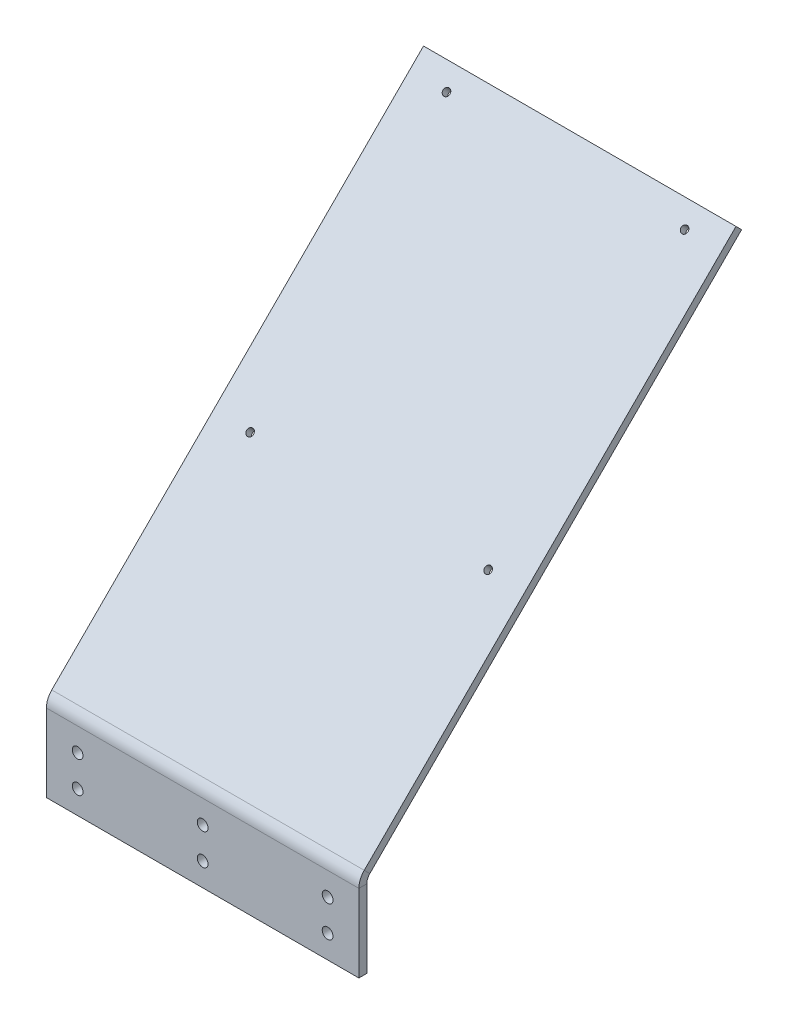
ISO-10303-21;
HEADER;
FILE_DESCRIPTION(('STEP AP214'),'2;1');
FILE_NAME('part.step','',(''),(''),'','','');
FILE_SCHEMA(('AUTOMOTIVE_DESIGN { 1 0 10303 214 1 1 1 1 }'));
ENDSEC;
DATA;
#1=APPLICATION_CONTEXT('core data for automotive mechanical design processes');
#2=APPLICATION_PROTOCOL_DEFINITION('international standard','automotive_design',2000,#1);
#3=PRODUCT_CONTEXT('',#1,'mechanical');
#4=PRODUCT('Part','Part','',(#3));
#5=PRODUCT_RELATED_PRODUCT_CATEGORY('part','',(#4));
#6=PRODUCT_DEFINITION_FORMATION('','',#4);
#7=PRODUCT_DEFINITION_CONTEXT('part definition',#1,'design');
#8=PRODUCT_DEFINITION('design','',#6,#7);
#9=PRODUCT_DEFINITION_SHAPE('','',#8);
#10=(LENGTH_UNIT() NAMED_UNIT(*) SI_UNIT(.MILLI.,.METRE.));
#11=(NAMED_UNIT(*) PLANE_ANGLE_UNIT() SI_UNIT($,.RADIAN.));
#12=(NAMED_UNIT(*) SI_UNIT($,.STERADIAN.) SOLID_ANGLE_UNIT());
#13=UNCERTAINTY_MEASURE_WITH_UNIT(LENGTH_MEASURE(1.E-05),#10,'distance_accuracy_value','');
#14=(GEOMETRIC_REPRESENTATION_CONTEXT(3) GLOBAL_UNCERTAINTY_ASSIGNED_CONTEXT((#13)) GLOBAL_UNIT_ASSIGNED_CONTEXT((#10,
#11,#12)) REPRESENTATION_CONTEXT('',''));
#15=CARTESIAN_POINT('',(0.,0.,0.));
#16=DIRECTION('',(0.,0.,1.));
#17=DIRECTION('',(1.,0.,0.));
#18=AXIS2_PLACEMENT_3D('',#15,#16,#17);
#19=CARTESIAN_POINT('',(0.,-48.5429784426507,-120.692314092932));
#20=DIRECTION('',(0.,-0.707106781186549,-0.707106781186546));
#21=DIRECTION('',(-1.,0.,0.));
#22=AXIS2_PLACEMENT_3D('',#19,#20,#21);
#23=PLANE('',#22);
#24=CARTESIAN_POINT('',(88.1,-115.949205151464,-53.2860873841182));
#25=DIRECTION('',(0.,0.707106781186549,0.707106781186546));
#26=DIRECTION('',(0.,-0.707106781186546,0.707106781186549));
#27=AXIS2_PLACEMENT_3D('',#24,#25,#26);
#28=CIRCLE('',#27,1.13029999999999);
#29=CARTESIAN_POINT('',(88.1,-116.74844794624,-52.486844589343));
#30=VERTEX_POINT('',#29);
#31=EDGE_CURVE('E594',#30,#30,#28,.T.);
#32=ORIENTED_EDGE('',*,*,#31,.F.);
#33=EDGE_LOOP('',(#32));
#34=FACE_BOUND('',#33,.T.);
#35=CARTESIAN_POINT('',(11.9,-115.949205151464,-53.2860873841182));
#36=DIRECTION('',(0.,0.707106781186549,0.707106781186546));
#37=DIRECTION('',(0.,-0.707106781186546,0.707106781186549));
#38=AXIS2_PLACEMENT_3D('',#35,#36,#37);
#39=CIRCLE('',#38,1.13029999999999);
#40=CARTESIAN_POINT('',(11.9,-116.74844794624,-52.486844589343));
#41=VERTEX_POINT('',#40);
#42=EDGE_CURVE('E598',#41,#41,#39,.T.);
#43=ORIENTED_EDGE('',*,*,#42,.F.);
#44=EDGE_LOOP('',(#43));
#45=FACE_BOUND('',#44,.T.);
#46=CARTESIAN_POINT('',(11.9,-53.0874123039804,-116.147880231602));
#47=DIRECTION('',(0.,0.707106781186549,0.707106781186546));
#48=DIRECTION('',(0.,-0.707106781186546,0.707106781186549));
#49=AXIS2_PLACEMENT_3D('',#46,#47,#48);
#50=CIRCLE('',#49,1.13029999999999);
#51=CARTESIAN_POINT('',(11.9,-53.8866550987556,-115.348637436827));
#52=VERTEX_POINT('',#51);
#53=EDGE_CURVE('E607',#52,#52,#50,.T.);
#54=ORIENTED_EDGE('',*,*,#53,.F.);
#55=EDGE_LOOP('',(#54));
#56=FACE_BOUND('',#55,.T.);
#57=CARTESIAN_POINT('',(88.1,-53.0874123039804,-116.147880231602));
#58=DIRECTION('',(0.,0.707106781186549,0.707106781186546));
#59=DIRECTION('',(0.,-0.707106781186546,0.707106781186549));
#60=AXIS2_PLACEMENT_3D('',#57,#58,#59);
#61=CIRCLE('',#60,1.13029999999999);
#62=CARTESIAN_POINT('',(88.1,-53.8866550987555,-115.348637436827));
#63=VERTEX_POINT('',#62);
#64=EDGE_CURVE('E615',#63,#63,#61,.T.);
#65=ORIENTED_EDGE('',*,*,#64,.F.);
#66=EDGE_LOOP('',(#65));
#67=FACE_BOUND('',#66,.T.);
#68=DIRECTION('',(0.,-0.707106781186546,0.707106781186549));
#69=VECTOR('',#68,1.);
#70=CARTESIAN_POINT('',(0.,-48.5429784426507,-120.692314092932));
#71=LINE('',#70,#69);
#72=CARTESIAN_POINT('',(0.,-48.5429784426507,-120.692314092932));
#73=VERTEX_POINT('',#72);
#74=CARTESIAN_POINT('',(0.,-167.516770863516,-1.71852167206607));
#75=VERTEX_POINT('',#74);
#76=EDGE_CURVE('E69',#73,#75,#71,.T.);
#77=ORIENTED_EDGE('',*,*,#76,.T.);
#78=DIRECTION('',(1.,0.,0.));
#79=VECTOR('',#78,1.);
#80=CARTESIAN_POINT('',(0.,-167.516770863516,-1.71852167206604));
#81=LINE('',#80,#79);
#82=CARTESIAN_POINT('',(100.,-167.516770863516,-1.71852167206607));
#83=VERTEX_POINT('',#82);
#84=EDGE_CURVE('E61',#75,#83,#81,.T.);
#85=ORIENTED_EDGE('',*,*,#84,.T.);
#86=DIRECTION('',(0.,-0.707106781186546,0.707106781186549));
#87=VECTOR('',#86,1.);
#88=CARTESIAN_POINT('',(100.,-48.5429784426507,-120.692314092932));
#89=LINE('',#88,#87);
#90=CARTESIAN_POINT('',(100.,-48.5429784426507,-120.692314092932));
#91=VERTEX_POINT('',#90);
#92=EDGE_CURVE('E77',#91,#83,#89,.T.);
#93=ORIENTED_EDGE('',*,*,#92,.F.);
#94=DIRECTION('',(1.,0.,0.));
#95=VECTOR('',#94,1.);
#96=CARTESIAN_POINT('',(0.,-48.5429784426507,-120.692314092932));
#97=LINE('',#96,#95);
#98=EDGE_CURVE('E204',#73,#91,#97,.T.);
#99=ORIENTED_EDGE('',*,*,#98,.F.);
#100=EDGE_LOOP('',(#77,#85,#93,#99));
#101=FACE_BOUND('',#100,.T.);
#102=ADVANCED_FACE('F51',(#34,#45,#56,#67,#101),#23,.F.);
#103=CARTESIAN_POINT('',(100.,-50.3390296668645,-122.488365317146));
#104=DIRECTION('',(-1.,0.,0.));
#105=DIRECTION('',(0.,-0.707106781186546,0.707106781186549));
#106=AXIS2_PLACEMENT_3D('',#103,#104,#105);
#107=PLANE('',#106);
#108=ORIENTED_EDGE('',*,*,#92,.T.);
#109=DIRECTION('',(0.,-0.707106781186549,-0.707106781186546));
#110=VECTOR('',#109,1.);
#111=CARTESIAN_POINT('',(100.,-169.31282208773,-3.51457289627986));
#112=LINE('',#111,#110);
#113=CARTESIAN_POINT('',(100.,-169.31282208773,-3.51457289627991));
#114=VERTEX_POINT('',#113);
#115=EDGE_CURVE('E215',#83,#114,#112,.T.);
#116=ORIENTED_EDGE('',*,*,#115,.T.);
#117=DIRECTION('',(0.,-0.707106781186546,0.707106781186549));
#118=VECTOR('',#117,1.);
#119=CARTESIAN_POINT('',(100.,-50.3390296668645,-122.488365317146));
#120=LINE('',#119,#118);
#121=CARTESIAN_POINT('',(100.,-50.3390296668645,-122.488365317146));
#122=VERTEX_POINT('',#121);
#123=EDGE_CURVE('E203',#122,#114,#120,.T.);
#124=ORIENTED_EDGE('',*,*,#123,.F.);
#125=DIRECTION('',(0.,0.707106781186549,0.707106781186546));
#126=VECTOR('',#125,1.);
#127=CARTESIAN_POINT('',(100.,-50.3390296668645,-122.488365317146));
#128=LINE('',#127,#126);
#129=EDGE_CURVE('E210',#122,#91,#128,.T.);
#130=ORIENTED_EDGE('',*,*,#129,.T.);
#131=EDGE_LOOP('',(#108,#116,#124,#130));
#132=FACE_BOUND('',#131,.T.);
#133=ADVANCED_FACE('F234',(#132),#107,.F.);
#134=CARTESIAN_POINT('',(0.,-50.3390296668645,-122.488365317146));
#135=DIRECTION('',(-1.,0.,0.));
#136=DIRECTION('',(0.,-0.707106781186546,0.707106781186549));
#137=AXIS2_PLACEMENT_3D('',#134,#135,#136);
#138=PLANE('',#137);
#139=DIRECTION('',(0.,-0.707106781186549,-0.707106781186546));
#140=VECTOR('',#139,1.);
#141=CARTESIAN_POINT('',(0.,-169.31282208773,-3.51457289627986));
#142=LINE('',#141,#140);
#143=CARTESIAN_POINT('',(0.,-169.31282208773,-3.51457289627989));
#144=VERTEX_POINT('',#143);
#145=EDGE_CURVE('E12',#75,#144,#142,.T.);
#146=ORIENTED_EDGE('',*,*,#145,.F.);
#147=ORIENTED_EDGE('',*,*,#76,.F.);
#148=DIRECTION('',(0.,0.707106781186549,0.707106781186546));
#149=VECTOR('',#148,1.);
#150=CARTESIAN_POINT('',(0.,-50.3390296668645,-122.488365317146));
#151=LINE('',#150,#149);
#152=CARTESIAN_POINT('',(0.,-50.3390296668645,-122.488365317146));
#153=VERTEX_POINT('',#152);
#154=EDGE_CURVE('E207',#153,#73,#151,.T.);
#155=ORIENTED_EDGE('',*,*,#154,.F.);
#156=DIRECTION('',(0.,-0.707106781186546,0.707106781186549));
#157=VECTOR('',#156,1.);
#158=CARTESIAN_POINT('',(0.,-50.3390296668645,-122.488365317146));
#159=LINE('',#158,#157);
#160=EDGE_CURVE('E202',#153,#144,#159,.T.);
#161=ORIENTED_EDGE('',*,*,#160,.T.);
#162=EDGE_LOOP('',(#146,#147,#155,#161));
#163=FACE_BOUND('',#162,.T.);
#164=ADVANCED_FACE('F53',(#163),#138,.T.);
#165=CARTESIAN_POINT('',(0.,-50.3390296668645,-122.488365317146));
#166=DIRECTION('',(0.,-0.707106781186546,0.707106781186549));
#167=DIRECTION('',(0.,-0.707106781186549,-0.707106781186546));
#168=AXIS2_PLACEMENT_3D('',#165,#166,#167);
#169=PLANE('',#168);
#170=ORIENTED_EDGE('',*,*,#98,.T.);
#171=ORIENTED_EDGE('',*,*,#129,.F.);
#172=DIRECTION('',(1.,0.,0.));
#173=VECTOR('',#172,1.);
#174=CARTESIAN_POINT('',(0.,-50.3390296668645,-122.488365317146));
#175=LINE('',#174,#173);
#176=EDGE_CURVE('E199',#153,#122,#175,.T.);
#177=ORIENTED_EDGE('',*,*,#176,.F.);
#178=ORIENTED_EDGE('',*,*,#154,.T.);
#179=EDGE_LOOP('',(#170,#171,#177,#178));
#180=FACE_BOUND('',#179,.T.);
#181=ADVANCED_FACE('F259',(#180),#169,.F.);
#182=CARTESIAN_POINT('',(0.,-50.3390296668645,-122.488365317146));
#183=DIRECTION('',(0.,-0.707106781186549,-0.707106781186546));
#184=DIRECTION('',(-1.,0.,0.));
#185=AXIS2_PLACEMENT_3D('',#182,#183,#184);
#186=PLANE('',#185);
#187=CARTESIAN_POINT('',(88.1,-117.745256375678,-55.082138608332));
#188=DIRECTION('',(0.,-0.707106781186549,-0.707106781186546));
#189=DIRECTION('',(0.,0.707106781186546,-0.707106781186549));
#190=AXIS2_PLACEMENT_3D('',#187,#188,#189);
#191=CIRCLE('',#190,1.13029999999998);
#192=CARTESIAN_POINT('',(88.1,-116.946013580903,-55.8813814031071));
#193=VERTEX_POINT('',#192);
#194=EDGE_CURVE('E55',#193,#193,#191,.T.);
#195=ORIENTED_EDGE('',*,*,#194,.F.);
#196=EDGE_LOOP('',(#195));
#197=FACE_BOUND('',#196,.T.);
#198=CARTESIAN_POINT('',(11.9,-117.745256375678,-55.082138608332));
#199=DIRECTION('',(0.,-0.707106781186549,-0.707106781186546));
#200=DIRECTION('',(0.,0.707106781186546,-0.707106781186549));
#201=AXIS2_PLACEMENT_3D('',#198,#199,#200);
#202=CIRCLE('',#201,1.13029999999998);
#203=CARTESIAN_POINT('',(11.9,-116.946013580903,-55.8813814031071));
#204=VERTEX_POINT('',#203);
#205=EDGE_CURVE('E603',#204,#204,#202,.T.);
#206=ORIENTED_EDGE('',*,*,#205,.F.);
#207=EDGE_LOOP('',(#206));
#208=FACE_BOUND('',#207,.T.);
#209=CARTESIAN_POINT('',(11.9,-54.8834635281942,-117.943931455816));
#210=DIRECTION('',(0.,-0.707106781186549,-0.707106781186546));
#211=DIRECTION('',(0.,0.707106781186546,-0.707106781186549));
#212=AXIS2_PLACEMENT_3D('',#209,#210,#211);
#213=CIRCLE('',#212,1.13029999999998);
#214=CARTESIAN_POINT('',(11.9,-54.0842207334191,-118.743174250591));
#215=VERTEX_POINT('',#214);
#216=EDGE_CURVE('E611',#215,#215,#213,.T.);
#217=ORIENTED_EDGE('',*,*,#216,.F.);
#218=EDGE_LOOP('',(#217));
#219=FACE_BOUND('',#218,.T.);
#220=CARTESIAN_POINT('',(88.1,-54.8834635281942,-117.943931455816));
#221=DIRECTION('',(0.,-0.707106781186549,-0.707106781186546));
#222=DIRECTION('',(0.,0.707106781186546,-0.707106781186549));
#223=AXIS2_PLACEMENT_3D('',#220,#221,#222);
#224=CIRCLE('',#223,1.13029999999998);
#225=CARTESIAN_POINT('',(88.1,-54.0842207334191,-118.743174250591));
#226=VERTEX_POINT('',#225);
#227=EDGE_CURVE('E619',#226,#226,#224,.T.);
#228=ORIENTED_EDGE('',*,*,#227,.F.);
#229=EDGE_LOOP('',(#228));
#230=FACE_BOUND('',#229,.T.);
#231=DIRECTION('',(1.,0.,0.));
#232=VECTOR('',#231,1.);
#233=CARTESIAN_POINT('',(0.,-169.31282208773,-3.51457289627986));
#234=LINE('',#233,#232);
#235=EDGE_CURVE('E160',#144,#114,#234,.T.);
#236=ORIENTED_EDGE('',*,*,#235,.F.);
#237=ORIENTED_EDGE('',*,*,#160,.F.);
#238=ORIENTED_EDGE('',*,*,#176,.T.);
#239=ORIENTED_EDGE('',*,*,#123,.T.);
#240=EDGE_LOOP('',(#236,#237,#238,#239));
#241=FACE_BOUND('',#240,.T.);
#242=ADVANCED_FACE('F230',(#197,#208,#219,#230,#241),#186,.T.);
#243=CARTESIAN_POINT('',(0.,-196.50497,-2.54));
#244=DIRECTION('',(0.,-1.,0.));
#245=DIRECTION('',(0.,0.,-1.));
#246=AXIS2_PLACEMENT_3D('',#243,#244,#245);
#247=PLANE('',#246);
#248=DIRECTION('',(1.,0.,0.));
#249=VECTOR('',#248,1.);
#250=CARTESIAN_POINT('',(0.,-196.50497,0.));
#251=LINE('',#250,#249);
#252=CARTESIAN_POINT('',(0.,-196.50497,0.));
#253=VERTEX_POINT('',#252);
#254=CARTESIAN_POINT('',(100.,-196.50497,0.));
#255=VERTEX_POINT('',#254);
#256=EDGE_CURVE('E186',#253,#255,#251,.T.);
#257=ORIENTED_EDGE('',*,*,#256,.F.);
#258=DIRECTION('',(0.,0.,1.));
#259=VECTOR('',#258,1.);
#260=CARTESIAN_POINT('',(0.,-196.50497,-2.54));
#261=LINE('',#260,#259);
#262=CARTESIAN_POINT('',(0.,-196.50497,-2.54));
#263=VERTEX_POINT('',#262);
#264=EDGE_CURVE('E177',#263,#253,#261,.T.);
#265=ORIENTED_EDGE('',*,*,#264,.F.);
#266=DIRECTION('',(1.,0.,0.));
#267=VECTOR('',#266,1.);
#268=CARTESIAN_POINT('',(0.,-196.50497,-2.54));
#269=LINE('',#268,#267);
#270=CARTESIAN_POINT('',(100.,-196.50497,-2.54));
#271=VERTEX_POINT('',#270);
#272=EDGE_CURVE('E155',#263,#271,#269,.T.);
#273=ORIENTED_EDGE('',*,*,#272,.T.);
#274=DIRECTION('',(0.,0.,1.));
#275=VECTOR('',#274,1.);
#276=CARTESIAN_POINT('',(100.,-196.50497,-2.54));
#277=LINE('',#276,#275);
#278=EDGE_CURVE('E128',#271,#255,#277,.T.);
#279=ORIENTED_EDGE('',*,*,#278,.T.);
#280=EDGE_LOOP('',(#257,#265,#273,#279));
#281=FACE_BOUND('',#280,.T.);
#282=ADVANCED_FACE('F250',(#281),#247,.T.);
#283=CARTESIAN_POINT('',(0.,0.,-2.54));
#284=DIRECTION('',(0.,0.,-1.));
#285=DIRECTION('',(-1.,0.,0.));
#286=AXIS2_PLACEMENT_3D('',#283,#284,#285);
#287=PLANE('',#286);
#288=CARTESIAN_POINT('',(9.99999999999998,-189.08497,-2.54));
#289=DIRECTION('',(0.,0.,-1.));
#290=DIRECTION('',(-1.,0.,0.));
#291=AXIS2_PLACEMENT_3D('',#288,#289,#290);
#292=CIRCLE('',#291,1.72499999999997);
#293=CARTESIAN_POINT('',(8.27500000000001,-189.08497,-2.54));
#294=VERTEX_POINT('',#293);
#295=EDGE_CURVE('E174',#294,#294,#292,.T.);
#296=ORIENTED_EDGE('',*,*,#295,.F.);
#297=EDGE_LOOP('',(#296));
#298=FACE_BOUND('',#297,.T.);
#299=CARTESIAN_POINT('',(90.,-189.08497,-2.54));
#300=DIRECTION('',(0.,0.,-1.));
#301=DIRECTION('',(-1.,0.,0.));
#302=AXIS2_PLACEMENT_3D('',#299,#300,#301);
#303=CIRCLE('',#302,1.72499999999998);
#304=CARTESIAN_POINT('',(88.275,-189.08497,-2.54));
#305=VERTEX_POINT('',#304);
#306=EDGE_CURVE('E663',#305,#305,#303,.T.);
#307=ORIENTED_EDGE('',*,*,#306,.F.);
#308=EDGE_LOOP('',(#307));
#309=FACE_BOUND('',#308,.T.);
#310=CARTESIAN_POINT('',(50.,-189.08497,-2.54));
#311=DIRECTION('',(0.,0.,-1.));
#312=DIRECTION('',(-1.,0.,0.));
#313=AXIS2_PLACEMENT_3D('',#310,#311,#312);
#314=CIRCLE('',#313,1.72499999999998);
#315=CARTESIAN_POINT('',(48.275,-189.08497,-2.54));
#316=VERTEX_POINT('',#315);
#317=EDGE_CURVE('E659',#316,#316,#314,.T.);
#318=ORIENTED_EDGE('',*,*,#317,.F.);
#319=EDGE_LOOP('',(#318));
#320=FACE_BOUND('',#319,.T.);
#321=CARTESIAN_POINT('',(90.,-179.08497,-2.54));
#322=DIRECTION('',(0.,0.,-1.));
#323=DIRECTION('',(-1.,0.,0.));
#324=AXIS2_PLACEMENT_3D('',#321,#322,#323);
#325=CIRCLE('',#324,1.72499999999998);
#326=CARTESIAN_POINT('',(88.275,-179.08497,-2.54));
#327=VERTEX_POINT('',#326);
#328=EDGE_CURVE('E655',#327,#327,#325,.T.);
#329=ORIENTED_EDGE('',*,*,#328,.F.);
#330=EDGE_LOOP('',(#329));
#331=FACE_BOUND('',#330,.T.);
#332=CARTESIAN_POINT('',(50.,-179.08497,-2.54));
#333=DIRECTION('',(0.,0.,-1.));
#334=DIRECTION('',(-1.,0.,0.));
#335=AXIS2_PLACEMENT_3D('',#332,#333,#334);
#336=CIRCLE('',#335,1.72499999999998);
#337=CARTESIAN_POINT('',(48.275,-179.08497,-2.54));
#338=VERTEX_POINT('',#337);
#339=EDGE_CURVE('E651',#338,#338,#336,.T.);
#340=ORIENTED_EDGE('',*,*,#339,.F.);
#341=EDGE_LOOP('',(#340));
#342=FACE_BOUND('',#341,.T.);
#343=CARTESIAN_POINT('',(9.99999999999998,-179.08497,-2.54));
#344=DIRECTION('',(0.,0.,-1.));
#345=DIRECTION('',(-1.,0.,0.));
#346=AXIS2_PLACEMENT_3D('',#343,#344,#345);
#347=CIRCLE('',#346,1.72499999999997);
#348=CARTESIAN_POINT('',(8.27500000000001,-179.08497,-2.54));
#349=VERTEX_POINT('',#348);
#350=EDGE_CURVE('E647',#349,#349,#347,.T.);
#351=ORIENTED_EDGE('',*,*,#350,.F.);
#352=EDGE_LOOP('',(#351));
#353=FACE_BOUND('',#352,.T.);
#354=DIRECTION('',(0.,-1.,0.));
#355=VECTOR('',#354,1.);
#356=CARTESIAN_POINT('',(0.,0.,-2.54));
#357=LINE('',#356,#355);
#358=CARTESIAN_POINT('',(0.,-171.66564919145,-2.54));
#359=VERTEX_POINT('',#358);
#360=EDGE_CURVE('E138',#359,#263,#357,.T.);
#361=ORIENTED_EDGE('',*,*,#360,.F.);
#362=DIRECTION('',(1.,0.,0.));
#363=VECTOR('',#362,1.);
#364=CARTESIAN_POINT('',(0.,-171.66564919145,-2.54));
#365=LINE('',#364,#363);
#366=CARTESIAN_POINT('',(100.,-171.66564919145,-2.54));
#367=VERTEX_POINT('',#366);
#368=EDGE_CURVE('E134',#359,#367,#365,.T.);
#369=ORIENTED_EDGE('',*,*,#368,.T.);
#370=DIRECTION('',(0.,-1.,0.));
#371=VECTOR('',#370,1.);
#372=CARTESIAN_POINT('',(100.,0.,-2.54));
#373=LINE('',#372,#371);
#374=EDGE_CURVE('E121',#367,#271,#373,.T.);
#375=ORIENTED_EDGE('',*,*,#374,.T.);
#376=ORIENTED_EDGE('',*,*,#272,.F.);
#377=EDGE_LOOP('',(#361,#369,#375,#376));
#378=FACE_BOUND('',#377,.T.);
#379=ADVANCED_FACE('F137',(#298,#309,#320,#331,#342,#353,#378),#287,.T.);
#380=CARTESIAN_POINT('',(100.,0.,-2.54));
#381=DIRECTION('',(-1.,0.,0.));
#382=DIRECTION('',(0.,-1.,0.));
#383=AXIS2_PLACEMENT_3D('',#380,#381,#382);
#384=PLANE('',#383);
#385=DIRECTION('',(0.,0.,-1.));
#386=VECTOR('',#385,1.);
#387=CARTESIAN_POINT('',(100.,-171.66564919145,-2.54));
#388=LINE('',#387,#386);
#389=CARTESIAN_POINT('',(100.,-171.66564919145,0.));
#390=VERTEX_POINT('',#389);
#391=EDGE_CURVE('E125',#390,#367,#388,.T.);
#392=ORIENTED_EDGE('',*,*,#391,.F.);
#393=DIRECTION('',(0.,-1.,0.));
#394=VECTOR('',#393,1.);
#395=CARTESIAN_POINT('',(100.,0.,0.));
#396=LINE('',#395,#394);
#397=EDGE_CURVE('E133',#390,#255,#396,.T.);
#398=ORIENTED_EDGE('',*,*,#397,.T.);
#399=ORIENTED_EDGE('',*,*,#278,.F.);
#400=ORIENTED_EDGE('',*,*,#374,.F.);
#401=EDGE_LOOP('',(#392,#398,#399,#400));
#402=FACE_BOUND('',#401,.T.);
#403=ADVANCED_FACE('F123',(#402),#384,.F.);
#404=CARTESIAN_POINT('',(0.,0.,0.));
#405=DIRECTION('',(0.,0.,-1.));
#406=DIRECTION('',(-1.,0.,0.));
#407=AXIS2_PLACEMENT_3D('',#404,#405,#406);
#408=PLANE('',#407);
#409=CARTESIAN_POINT('',(9.99999999999998,-189.08497,0.));
#410=DIRECTION('',(0.,0.,1.));
#411=DIRECTION('',(1.,0.,0.));
#412=AXIS2_PLACEMENT_3D('',#409,#410,#411);
#413=CIRCLE('',#412,1.72499999999997);
#414=CARTESIAN_POINT('',(11.7249999999999,-189.08497,0.));
#415=VERTEX_POINT('',#414);
#416=EDGE_CURVE('E623',#415,#415,#413,.T.);
#417=ORIENTED_EDGE('',*,*,#416,.F.);
#418=EDGE_LOOP('',(#417));
#419=FACE_BOUND('',#418,.T.);
#420=CARTESIAN_POINT('',(90.,-189.08497,0.));
#421=DIRECTION('',(0.,0.,1.));
#422=DIRECTION('',(1.,0.,0.));
#423=AXIS2_PLACEMENT_3D('',#420,#421,#422);
#424=CIRCLE('',#423,1.72499999999998);
#425=CARTESIAN_POINT('',(91.725,-189.08497,0.));
#426=VERTEX_POINT('',#425);
#427=EDGE_CURVE('E637',#426,#426,#424,.T.);
#428=ORIENTED_EDGE('',*,*,#427,.F.);
#429=EDGE_LOOP('',(#428));
#430=FACE_BOUND('',#429,.T.);
#431=CARTESIAN_POINT('',(50.,-189.08497,0.));
#432=DIRECTION('',(0.,0.,1.));
#433=DIRECTION('',(1.,0.,0.));
#434=AXIS2_PLACEMENT_3D('',#431,#432,#433);
#435=CIRCLE('',#434,1.72499999999998);
#436=CARTESIAN_POINT('',(51.725,-189.08497,0.));
#437=VERTEX_POINT('',#436);
#438=EDGE_CURVE('E633',#437,#437,#435,.T.);
#439=ORIENTED_EDGE('',*,*,#438,.F.);
#440=EDGE_LOOP('',(#439));
#441=FACE_BOUND('',#440,.T.);
#442=CARTESIAN_POINT('',(90.,-179.08497,0.));
#443=DIRECTION('',(0.,0.,1.));
#444=DIRECTION('',(1.,0.,0.));
#445=AXIS2_PLACEMENT_3D('',#442,#443,#444);
#446=CIRCLE('',#445,1.72499999999998);
#447=CARTESIAN_POINT('',(91.725,-179.08497,0.));
#448=VERTEX_POINT('',#447);
#449=EDGE_CURVE('E629',#448,#448,#446,.T.);
#450=ORIENTED_EDGE('',*,*,#449,.F.);
#451=EDGE_LOOP('',(#450));
#452=FACE_BOUND('',#451,.T.);
#453=CARTESIAN_POINT('',(50.,-179.08497,0.));
#454=DIRECTION('',(0.,0.,1.));
#455=DIRECTION('',(1.,0.,0.));
#456=AXIS2_PLACEMENT_3D('',#453,#454,#455);
#457=CIRCLE('',#456,1.72499999999998);
#458=CARTESIAN_POINT('',(51.725,-179.08497,0.));
#459=VERTEX_POINT('',#458);
#460=EDGE_CURVE('E624',#459,#459,#457,.T.);
#461=ORIENTED_EDGE('',*,*,#460,.F.);
#462=EDGE_LOOP('',(#461));
#463=FACE_BOUND('',#462,.T.);
#464=CARTESIAN_POINT('',(9.99999999999998,-179.08497,0.));
#465=DIRECTION('',(0.,0.,1.));
#466=DIRECTION('',(1.,0.,0.));
#467=AXIS2_PLACEMENT_3D('',#464,#465,#466);
#468=CIRCLE('',#467,1.72499999999997);
#469=CARTESIAN_POINT('',(11.7249999999999,-179.08497,0.));
#470=VERTEX_POINT('',#469);
#471=EDGE_CURVE('E628',#470,#470,#468,.T.);
#472=ORIENTED_EDGE('',*,*,#471,.F.);
#473=EDGE_LOOP('',(#472));
#474=FACE_BOUND('',#473,.T.);
#475=DIRECTION('',(1.,0.,0.));
#476=VECTOR('',#475,1.);
#477=CARTESIAN_POINT('',(0.,-171.66564919145,0.));
#478=LINE('',#477,#476);
#479=CARTESIAN_POINT('',(0.,-171.66564919145,0.));
#480=VERTEX_POINT('',#479);
#481=EDGE_CURVE('E156',#480,#390,#478,.T.);
#482=ORIENTED_EDGE('',*,*,#481,.F.);
#483=DIRECTION('',(0.,-1.,0.));
#484=VECTOR('',#483,1.);
#485=CARTESIAN_POINT('',(0.,0.,0.));
#486=LINE('',#485,#484);
#487=EDGE_CURVE('E190',#480,#253,#486,.T.);
#488=ORIENTED_EDGE('',*,*,#487,.T.);
#489=ORIENTED_EDGE('',*,*,#256,.T.);
#490=ORIENTED_EDGE('',*,*,#397,.F.);
#491=EDGE_LOOP('',(#482,#488,#489,#490));
#492=FACE_BOUND('',#491,.T.);
#493=ADVANCED_FACE('F242',(#419,#430,#441,#452,#463,#474,#492),#408,.F.);
#494=CARTESIAN_POINT('',(0.,0.,-2.54));
#495=DIRECTION('',(-1.,0.,0.));
#496=DIRECTION('',(0.,-1.,0.));
#497=AXIS2_PLACEMENT_3D('',#494,#495,#496);
#498=PLANE('',#497);
#499=ORIENTED_EDGE('',*,*,#487,.F.);
#500=DIRECTION('',(0.,0.,-1.));
#501=VECTOR('',#500,1.);
#502=CARTESIAN_POINT('',(0.,-171.66564919145,-2.54));
#503=LINE('',#502,#501);
#504=EDGE_CURVE('E183',#480,#359,#503,.T.);
#505=ORIENTED_EDGE('',*,*,#504,.T.);
#506=ORIENTED_EDGE('',*,*,#360,.T.);
#507=ORIENTED_EDGE('',*,*,#264,.T.);
#508=EDGE_LOOP('',(#499,#505,#506,#507));
#509=FACE_BOUND('',#508,.T.);
#510=ADVANCED_FACE('F246',(#509),#498,.T.);
#511=CARTESIAN_POINT('',(0.,-171.66564919145,-5.8674));
#512=DIRECTION('',(1.,0.,0.));
#513=DIRECTION('',(0.,0.,-1.));
#514=AXIS2_PLACEMENT_3D('',#511,#512,#513);
#515=PLANE('',#514);
#516=ORIENTED_EDGE('',*,*,#504,.F.);
#517=CARTESIAN_POINT('',(0.,-171.66564919145,-5.8674));
#518=DIRECTION('',(1.,0.,0.));
#519=DIRECTION('',(0.,0.,-1.));
#520=AXIS2_PLACEMENT_3D('',#517,#518,#519);
#521=CIRCLE('',#520,5.8674);
#522=EDGE_CURVE('E170',#480,#75,#521,.F.);
#523=ORIENTED_EDGE('',*,*,#522,.T.);
#524=ORIENTED_EDGE('',*,*,#145,.T.);
#525=CARTESIAN_POINT('',(0.,-171.66564919145,-5.8674));
#526=DIRECTION('',(-1.,0.,0.));
#527=DIRECTION('',(0.,0.,-1.));
#528=AXIS2_PLACEMENT_3D('',#525,#526,#527);
#529=CIRCLE('',#528,3.3274);
#530=EDGE_CURVE('E162',#359,#144,#529,.T.);
#531=ORIENTED_EDGE('',*,*,#530,.F.);
#532=EDGE_LOOP('',(#516,#523,#524,#531));
#533=FACE_BOUND('',#532,.T.);
#534=ADVANCED_FACE('F244',(#533),#515,.F.);
#535=CARTESIAN_POINT('',(100.,-171.66564919145,-5.8674));
#536=DIRECTION('',(-1.,0.,0.));
#537=DIRECTION('',(0.,0.,1.));
#538=AXIS2_PLACEMENT_3D('',#535,#536,#537);
#539=PLANE('',#538);
#540=CARTESIAN_POINT('',(99.9999999999999,-171.66564919145,-5.8674));
#541=DIRECTION('',(1.,0.,0.));
#542=DIRECTION('',(0.,0.,-1.));
#543=AXIS2_PLACEMENT_3D('',#540,#541,#542);
#544=CIRCLE('',#543,5.8674);
#545=EDGE_CURVE('E153',#83,#390,#544,.T.);
#546=ORIENTED_EDGE('',*,*,#545,.T.);
#547=ORIENTED_EDGE('',*,*,#391,.T.);
#548=CARTESIAN_POINT('',(100.,-171.66564919145,-5.8674));
#549=DIRECTION('',(1.,0.,0.));
#550=DIRECTION('',(0.,0.,-1.));
#551=AXIS2_PLACEMENT_3D('',#548,#549,#550);
#552=CIRCLE('',#551,3.3274);
#553=EDGE_CURVE('E151',#114,#367,#552,.T.);
#554=ORIENTED_EDGE('',*,*,#553,.F.);
#555=ORIENTED_EDGE('',*,*,#115,.F.);
#556=EDGE_LOOP('',(#546,#547,#554,#555));
#557=FACE_BOUND('',#556,.T.);
#558=ADVANCED_FACE('F149',(#557),#539,.F.);
#559=CARTESIAN_POINT('',(-50.0904019207496,-171.66564919145,-5.8674));
#560=DIRECTION('',(1.,0.,0.));
#561=DIRECTION('',(0.,0.,-1.));
#562=AXIS2_PLACEMENT_3D('',#559,#560,#561);
#563=CYLINDRICAL_SURFACE('',#562,3.3274);
#564=ORIENTED_EDGE('',*,*,#235,.T.);
#565=ORIENTED_EDGE('',*,*,#553,.T.);
#566=ORIENTED_EDGE('',*,*,#368,.F.);
#567=ORIENTED_EDGE('',*,*,#530,.T.);
#568=EDGE_LOOP('',(#564,#565,#566,#567));
#569=FACE_BOUND('',#568,.T.);
#570=ADVANCED_FACE('F159',(#569),#563,.F.);
#571=CARTESIAN_POINT('',(-50.0904019207496,-171.66564919145,-5.8674));
#572=DIRECTION('',(1.,0.,0.));
#573=DIRECTION('',(0.,0.,-1.));
#574=AXIS2_PLACEMENT_3D('',#571,#572,#573);
#575=CYLINDRICAL_SURFACE('',#574,5.8674);
#576=ORIENTED_EDGE('',*,*,#84,.F.);
#577=ORIENTED_EDGE('',*,*,#522,.F.);
#578=ORIENTED_EDGE('',*,*,#481,.T.);
#579=ORIENTED_EDGE('',*,*,#545,.F.);
#580=EDGE_LOOP('',(#576,#577,#578,#579));
#581=FACE_BOUND('',#580,.T.);
#582=ADVANCED_FACE('F237',(#581),#575,.T.);
#583=CARTESIAN_POINT('',(9.99999999999998,-179.08497,-122.488365317146));
#584=DIRECTION('',(0.,0.,1.));
#585=DIRECTION('',(1.,0.,0.));
#586=AXIS2_PLACEMENT_3D('',#583,#584,#585);
#587=CYLINDRICAL_SURFACE('',#586,1.72499999999997);
#588=ORIENTED_EDGE('',*,*,#350,.T.);
#589=EDGE_LOOP('',(#588));
#590=FACE_BOUND('',#589,.T.);
#591=ORIENTED_EDGE('',*,*,#471,.T.);
#592=EDGE_LOOP('',(#591));
#593=FACE_BOUND('',#592,.T.);
#594=ADVANCED_FACE('F317',(#590,#593),#587,.F.);
#595=CARTESIAN_POINT('',(50.,-179.08497,-122.488365317146));
#596=DIRECTION('',(0.,0.,1.));
#597=DIRECTION('',(1.,0.,0.));
#598=AXIS2_PLACEMENT_3D('',#595,#596,#597);
#599=CYLINDRICAL_SURFACE('',#598,1.72499999999998);
#600=ORIENTED_EDGE('',*,*,#339,.T.);
#601=EDGE_LOOP('',(#600));
#602=FACE_BOUND('',#601,.T.);
#603=ORIENTED_EDGE('',*,*,#460,.T.);
#604=EDGE_LOOP('',(#603));
#605=FACE_BOUND('',#604,.T.);
#606=ADVANCED_FACE('F323',(#602,#605),#599,.F.);
#607=CARTESIAN_POINT('',(90.,-179.08497,-122.488365317146));
#608=DIRECTION('',(0.,0.,1.));
#609=DIRECTION('',(1.,0.,0.));
#610=AXIS2_PLACEMENT_3D('',#607,#608,#609);
#611=CYLINDRICAL_SURFACE('',#610,1.72499999999998);
#612=ORIENTED_EDGE('',*,*,#328,.T.);
#613=EDGE_LOOP('',(#612));
#614=FACE_BOUND('',#613,.T.);
#615=ORIENTED_EDGE('',*,*,#449,.T.);
#616=EDGE_LOOP('',(#615));
#617=FACE_BOUND('',#616,.T.);
#618=ADVANCED_FACE('F331',(#614,#617),#611,.F.);
#619=CARTESIAN_POINT('',(50.,-189.08497,-122.488365317146));
#620=DIRECTION('',(0.,0.,1.));
#621=DIRECTION('',(1.,0.,0.));
#622=AXIS2_PLACEMENT_3D('',#619,#620,#621);
#623=CYLINDRICAL_SURFACE('',#622,1.72499999999998);
#624=ORIENTED_EDGE('',*,*,#317,.T.);
#625=EDGE_LOOP('',(#624));
#626=FACE_BOUND('',#625,.T.);
#627=ORIENTED_EDGE('',*,*,#438,.T.);
#628=EDGE_LOOP('',(#627));
#629=FACE_BOUND('',#628,.T.);
#630=ADVANCED_FACE('F339',(#626,#629),#623,.F.);
#631=CARTESIAN_POINT('',(90.,-189.08497,-122.488365317146));
#632=DIRECTION('',(0.,0.,1.));
#633=DIRECTION('',(1.,0.,0.));
#634=AXIS2_PLACEMENT_3D('',#631,#632,#633);
#635=CYLINDRICAL_SURFACE('',#634,1.72499999999998);
#636=ORIENTED_EDGE('',*,*,#306,.T.);
#637=EDGE_LOOP('',(#636));
#638=FACE_BOUND('',#637,.T.);
#639=ORIENTED_EDGE('',*,*,#427,.T.);
#640=EDGE_LOOP('',(#639));
#641=FACE_BOUND('',#640,.T.);
#642=ADVANCED_FACE('F347',(#638,#641),#635,.F.);
#643=CARTESIAN_POINT('',(9.99999999999998,-189.08497,-122.488365317146));
#644=DIRECTION('',(0.,0.,1.));
#645=DIRECTION('',(1.,0.,0.));
#646=AXIS2_PLACEMENT_3D('',#643,#644,#645);
#647=CYLINDRICAL_SURFACE('',#646,1.72499999999997);
#648=ORIENTED_EDGE('',*,*,#295,.T.);
#649=EDGE_LOOP('',(#648));
#650=FACE_BOUND('',#649,.T.);
#651=ORIENTED_EDGE('',*,*,#416,.T.);
#652=EDGE_LOOP('',(#651));
#653=FACE_BOUND('',#652,.T.);
#654=ADVANCED_FACE('F355',(#650,#653),#647,.F.);
#655=CARTESIAN_POINT('',(88.1,-53.0874123039804,-116.147880231602));
#656=DIRECTION('',(0.,0.707106781186549,0.707106781186546));
#657=DIRECTION('',(0.,-0.707106781186546,0.707106781186549));
#658=AXIS2_PLACEMENT_3D('',#655,#656,#657);
#659=CYLINDRICAL_SURFACE('',#658,1.13029999999998);
#660=ORIENTED_EDGE('',*,*,#227,.T.);
#661=EDGE_LOOP('',(#660));
#662=FACE_BOUND('',#661,.T.);
#663=ORIENTED_EDGE('',*,*,#64,.T.);
#664=EDGE_LOOP('',(#663));
#665=FACE_BOUND('',#664,.T.);
#666=ADVANCED_FACE('F363',(#662,#665),#659,.F.);
#667=CARTESIAN_POINT('',(11.9,-53.0874123039804,-116.147880231602));
#668=DIRECTION('',(0.,0.707106781186549,0.707106781186546));
#669=DIRECTION('',(0.,-0.707106781186546,0.707106781186549));
#670=AXIS2_PLACEMENT_3D('',#667,#668,#669);
#671=CYLINDRICAL_SURFACE('',#670,1.13029999999998);
#672=ORIENTED_EDGE('',*,*,#216,.T.);
#673=EDGE_LOOP('',(#672));
#674=FACE_BOUND('',#673,.T.);
#675=ORIENTED_EDGE('',*,*,#53,.T.);
#676=EDGE_LOOP('',(#675));
#677=FACE_BOUND('',#676,.T.);
#678=ADVANCED_FACE('F372',(#674,#677),#671,.F.);
#679=CARTESIAN_POINT('',(11.9,-115.949205151464,-53.2860873841182));
#680=DIRECTION('',(0.,0.707106781186549,0.707106781186546));
#681=DIRECTION('',(0.,-0.707106781186546,0.707106781186549));
#682=AXIS2_PLACEMENT_3D('',#679,#680,#681);
#683=CYLINDRICAL_SURFACE('',#682,1.13029999999998);
#684=ORIENTED_EDGE('',*,*,#205,.T.);
#685=EDGE_LOOP('',(#684));
#686=FACE_BOUND('',#685,.T.);
#687=ORIENTED_EDGE('',*,*,#42,.T.);
#688=EDGE_LOOP('',(#687));
#689=FACE_BOUND('',#688,.T.);
#690=ADVANCED_FACE('F380',(#686,#689),#683,.F.);
#691=CARTESIAN_POINT('',(88.1,-115.949205151464,-53.2860873841182));
#692=DIRECTION('',(0.,0.707106781186549,0.707106781186546));
#693=DIRECTION('',(0.,-0.707106781186546,0.707106781186549));
#694=AXIS2_PLACEMENT_3D('',#691,#692,#693);
#695=CYLINDRICAL_SURFACE('',#694,1.13029999999998);
#696=ORIENTED_EDGE('',*,*,#194,.T.);
#697=EDGE_LOOP('',(#696));
#698=FACE_BOUND('',#697,.T.);
#699=ORIENTED_EDGE('',*,*,#31,.T.);
#700=EDGE_LOOP('',(#699));
#701=FACE_BOUND('',#700,.T.);
#702=ADVANCED_FACE('F388',(#698,#701),#695,.F.);
#703=CLOSED_SHELL('',(#102,#133,#164,#181,#242,#282,#379,#403,#493,#510,#534,#558,#570,#582,
#594,#606,#618,#630,#642,#654,#666,#678,#690,#702));
#704=MANIFOLD_SOLID_BREP('B2',#703);
#705=ADVANCED_BREP_SHAPE_REPRESENTATION('',(#18,#704),#14);
#706=SHAPE_DEFINITION_REPRESENTATION(#9,#705);
ENDSEC;
END-ISO-10303-21;
